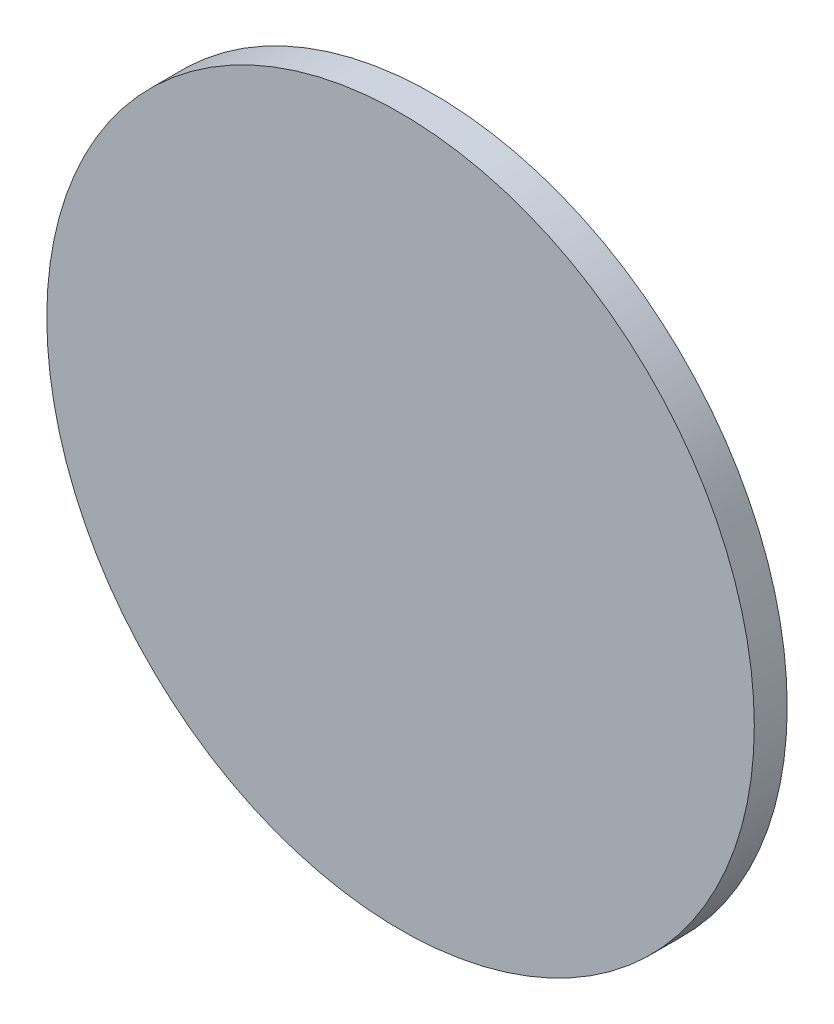
ISO-10303-21;
HEADER;
FILE_DESCRIPTION(('STEP AP214'),'2;1');
FILE_NAME('part.step','',(''),(''),'','','');
FILE_SCHEMA(('AUTOMOTIVE_DESIGN { 1 0 10303 214 1 1 1 1 }'));
ENDSEC;
DATA;
#1=APPLICATION_CONTEXT('core data for automotive mechanical design processes');
#2=APPLICATION_PROTOCOL_DEFINITION('international standard','automotive_design',2000,#1);
#3=PRODUCT_CONTEXT('',#1,'mechanical');
#4=PRODUCT('Part','Part','',(#3));
#5=PRODUCT_RELATED_PRODUCT_CATEGORY('part','',(#4));
#6=PRODUCT_DEFINITION_FORMATION('','',#4);
#7=PRODUCT_DEFINITION_CONTEXT('part definition',#1,'design');
#8=PRODUCT_DEFINITION('design','',#6,#7);
#9=PRODUCT_DEFINITION_SHAPE('','',#8);
#10=(LENGTH_UNIT() NAMED_UNIT(*) SI_UNIT(.MILLI.,.METRE.));
#11=(NAMED_UNIT(*) PLANE_ANGLE_UNIT() SI_UNIT($,.RADIAN.));
#12=(NAMED_UNIT(*) SI_UNIT($,.STERADIAN.) SOLID_ANGLE_UNIT());
#13=UNCERTAINTY_MEASURE_WITH_UNIT(LENGTH_MEASURE(1.E-05),#10,'distance_accuracy_value','');
#14=(GEOMETRIC_REPRESENTATION_CONTEXT(3) GLOBAL_UNCERTAINTY_ASSIGNED_CONTEXT((#13)) GLOBAL_UNIT_ASSIGNED_CONTEXT((#10,
#11,#12)) REPRESENTATION_CONTEXT('',''));
#15=CARTESIAN_POINT('',(0.,0.,0.));
#16=DIRECTION('',(0.,0.,1.));
#17=DIRECTION('',(1.,0.,0.));
#18=AXIS2_PLACEMENT_3D('',#15,#16,#17);
#19=CARTESIAN_POINT('',(0.,0.,4.));
#20=DIRECTION('',(0.,0.,-1.));
#21=DIRECTION('',(-1.,0.,0.));
#22=AXIS2_PLACEMENT_3D('',#19,#20,#21);
#23=CYLINDRICAL_SURFACE('',#22,43.);
#24=CARTESIAN_POINT('',(0.,0.,4.));
#25=DIRECTION('',(0.,0.,1.));
#26=DIRECTION('',(1.,0.,0.));
#27=AXIS2_PLACEMENT_3D('',#24,#25,#26);
#28=CIRCLE('',#27,43.);
#29=CARTESIAN_POINT('',(43.,0.,4.));
#30=VERTEX_POINT('',#29);
#31=EDGE_CURVE('E10',#30,#30,#28,.T.);
#32=ORIENTED_EDGE('',*,*,#31,.F.);
#33=EDGE_LOOP('',(#32));
#34=FACE_BOUND('',#33,.T.);
#35=CARTESIAN_POINT('',(0.,0.,0.));
#36=DIRECTION('',(0.,0.,1.));
#37=DIRECTION('',(1.,0.,0.));
#38=AXIS2_PLACEMENT_3D('',#35,#36,#37);
#39=CIRCLE('',#38,43.);
#40=CARTESIAN_POINT('',(43.,0.,0.));
#41=VERTEX_POINT('',#40);
#42=EDGE_CURVE('E40',#41,#41,#39,.T.);
#43=ORIENTED_EDGE('',*,*,#42,.T.);
#44=EDGE_LOOP('',(#43));
#45=FACE_BOUND('',#44,.T.);
#46=ADVANCED_FACE('F37',(#34,#45),#23,.T.);
#47=CARTESIAN_POINT('',(0.,0.,4.));
#48=DIRECTION('',(0.,0.,1.));
#49=DIRECTION('',(1.,0.,0.));
#50=AXIS2_PLACEMENT_3D('',#47,#48,#49);
#51=PLANE('',#50);
#52=ORIENTED_EDGE('',*,*,#31,.T.);
#53=EDGE_LOOP('',(#52));
#54=FACE_BOUND('',#53,.T.);
#55=ADVANCED_FACE('F54',(#54),#51,.T.);
#56=CARTESIAN_POINT('',(0.,0.,0.));
#57=DIRECTION('',(0.,0.,1.));
#58=DIRECTION('',(1.,0.,0.));
#59=AXIS2_PLACEMENT_3D('',#56,#57,#58);
#60=PLANE('',#59);
#61=ORIENTED_EDGE('',*,*,#42,.F.);
#62=EDGE_LOOP('',(#61));
#63=FACE_BOUND('',#62,.T.);
#64=ADVANCED_FACE('F52',(#63),#60,.F.);
#65=CLOSED_SHELL('',(#46,#55,#64));
#66=MANIFOLD_SOLID_BREP('B2',#65);
#67=ADVANCED_BREP_SHAPE_REPRESENTATION('',(#18,#66),#14);
#68=SHAPE_DEFINITION_REPRESENTATION(#9,#67);
ENDSEC;
END-ISO-10303-21;
